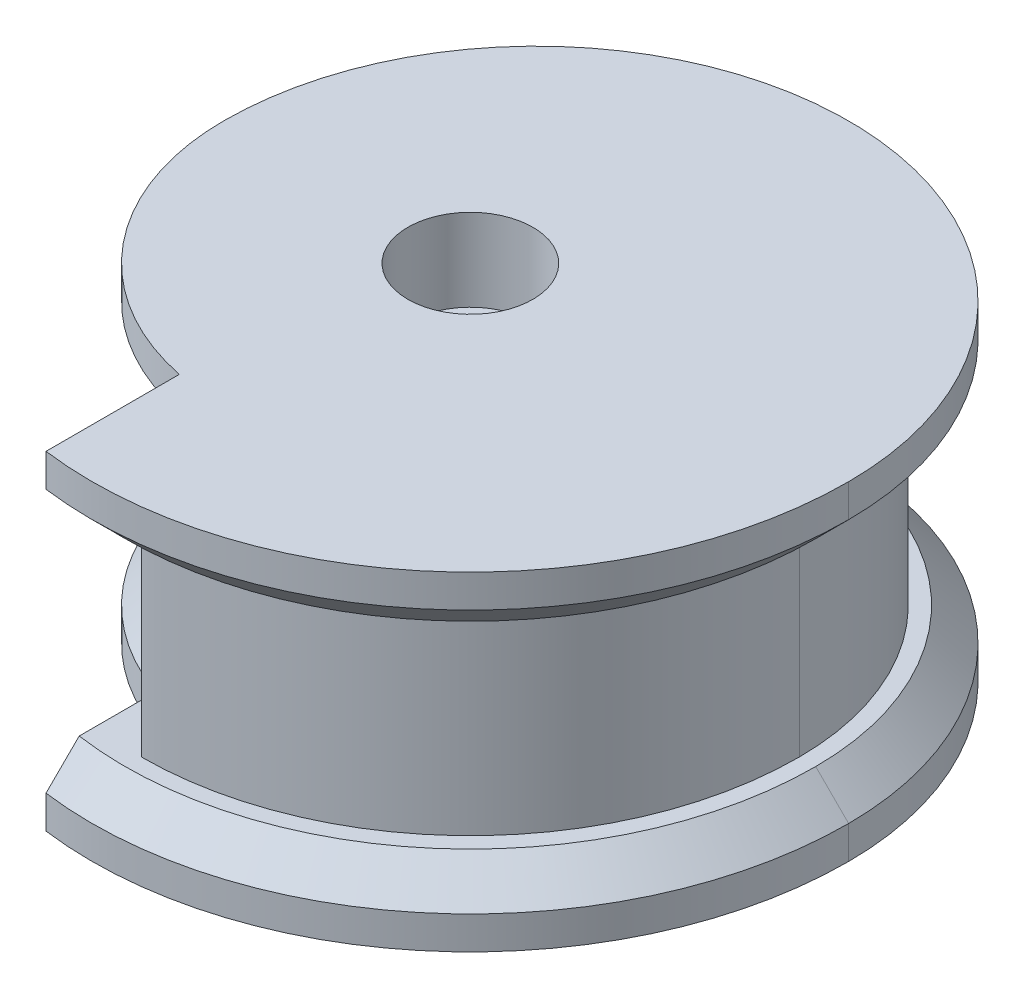
ISO-10303-21;
HEADER;
FILE_DESCRIPTION(('STEP AP214'),'2;1');
FILE_NAME('part.step','',(''),(''),'','','');
FILE_SCHEMA(('AUTOMOTIVE_DESIGN { 1 0 10303 214 1 1 1 1 }'));
ENDSEC;
DATA;
#1=APPLICATION_CONTEXT('core data for automotive mechanical design processes');
#2=APPLICATION_PROTOCOL_DEFINITION('international standard','automotive_design',2000,#1);
#3=PRODUCT_CONTEXT('',#1,'mechanical');
#4=PRODUCT('Part','Part','',(#3));
#5=PRODUCT_RELATED_PRODUCT_CATEGORY('part','',(#4));
#6=PRODUCT_DEFINITION_FORMATION('','',#4);
#7=PRODUCT_DEFINITION_CONTEXT('part definition',#1,'design');
#8=PRODUCT_DEFINITION('design','',#6,#7);
#9=PRODUCT_DEFINITION_SHAPE('','',#8);
#10=(LENGTH_UNIT() NAMED_UNIT(*) SI_UNIT(.MILLI.,.METRE.));
#11=(NAMED_UNIT(*) PLANE_ANGLE_UNIT() SI_UNIT($,.RADIAN.));
#12=(NAMED_UNIT(*) SI_UNIT($,.STERADIAN.) SOLID_ANGLE_UNIT());
#13=UNCERTAINTY_MEASURE_WITH_UNIT(LENGTH_MEASURE(1.E-05),#10,'distance_accuracy_value','');
#14=(GEOMETRIC_REPRESENTATION_CONTEXT(3) GLOBAL_UNCERTAINTY_ASSIGNED_CONTEXT((#13)) GLOBAL_UNIT_ASSIGNED_CONTEXT((#10,
#11,#12)) REPRESENTATION_CONTEXT('',''));
#15=CARTESIAN_POINT('',(0.,0.,0.));
#16=DIRECTION('',(0.,0.,1.));
#17=DIRECTION('',(1.,0.,0.));
#18=AXIS2_PLACEMENT_3D('',#15,#16,#17);
#19=CARTESIAN_POINT('',(0.,10.,0.));
#20=DIRECTION('',(0.,-1.,0.));
#21=DIRECTION('',(0.,0.,-1.));
#22=AXIS2_PLACEMENT_3D('',#19,#20,#21);
#23=CYLINDRICAL_SURFACE('',#22,6.);
#24=CARTESIAN_POINT('',(0.,8.,0.));
#25=DIRECTION('',(0.,1.,0.));
#26=DIRECTION('',(0.,0.,1.));
#27=AXIS2_PLACEMENT_3D('',#24,#25,#26);
#28=CIRCLE('',#27,6.);
#29=CARTESIAN_POINT('',(-6.,8.,0.));
#30=VERTEX_POINT('',#29);
#31=CARTESIAN_POINT('',(0.,8.,6.));
#32=VERTEX_POINT('',#31);
#33=EDGE_CURVE('E197',#30,#32,#28,.T.);
#34=ORIENTED_EDGE('',*,*,#33,.F.);
#35=DIRECTION('',(0.,-1.,0.));
#36=VECTOR('',#35,1.);
#37=CARTESIAN_POINT('',(-6.,34.0831891575846,0.));
#38=LINE('',#37,#36);
#39=CARTESIAN_POINT('',(-6.,2.,0.));
#40=VERTEX_POINT('',#39);
#41=EDGE_CURVE('E237',#30,#40,#38,.T.);
#42=ORIENTED_EDGE('',*,*,#41,.T.);
#43=CARTESIAN_POINT('',(0.,2.,0.));
#44=DIRECTION('',(0.,-1.,0.));
#45=DIRECTION('',(0.,0.,-1.));
#46=AXIS2_PLACEMENT_3D('',#43,#44,#45);
#47=CIRCLE('',#46,6.);
#48=CARTESIAN_POINT('',(0.,2.,6.));
#49=VERTEX_POINT('',#48);
#50=EDGE_CURVE('E199',#49,#40,#47,.T.);
#51=ORIENTED_EDGE('',*,*,#50,.F.);
#52=DIRECTION('',(0.,-1.,0.));
#53=VECTOR('',#52,1.);
#54=CARTESIAN_POINT('',(0.,34.0831891575846,6.));
#55=LINE('',#54,#53);
#56=EDGE_CURVE('E228',#32,#49,#55,.T.);
#57=ORIENTED_EDGE('',*,*,#56,.F.);
#58=EDGE_LOOP('',(#34,#42,#51,#57));
#59=FACE_BOUND('',#58,.T.);
#60=ADVANCED_FACE('F33',(#59),#23,.T.);
#61=CARTESIAN_POINT('',(0.,34.0831891575846,6.));
#62=DIRECTION('',(-1.,0.,0.));
#63=DIRECTION('',(0.,0.,1.));
#64=AXIS2_PLACEMENT_3D('',#61,#62,#63);
#65=PLANE('',#64);
#66=DIRECTION('',(0.,-1.,0.));
#67=VECTOR('',#66,1.);
#68=CARTESIAN_POINT('',(0.,34.0831891575846,10.));
#69=LINE('',#68,#67);
#70=CARTESIAN_POINT('',(0.,8.,10.));
#71=VERTEX_POINT('',#70);
#72=CARTESIAN_POINT('',(0.,2.,10.));
#73=VERTEX_POINT('',#72);
#74=EDGE_CURVE('E236',#71,#73,#69,.T.);
#75=ORIENTED_EDGE('',*,*,#74,.F.);
#76=DIRECTION('',(0.,0.,-1.));
#77=VECTOR('',#76,1.);
#78=CARTESIAN_POINT('',(0.,8.,6.));
#79=LINE('',#78,#77);
#80=EDGE_CURVE('E194',#71,#32,#79,.T.);
#81=ORIENTED_EDGE('',*,*,#80,.T.);
#82=ORIENTED_EDGE('',*,*,#56,.T.);
#83=DIRECTION('',(0.,0.,-1.));
#84=VECTOR('',#83,1.);
#85=CARTESIAN_POINT('',(0.,2.,10.));
#86=LINE('',#85,#84);
#87=EDGE_CURVE('E208',#73,#49,#86,.T.);
#88=ORIENTED_EDGE('',*,*,#87,.F.);
#89=EDGE_LOOP('',(#75,#81,#82,#88));
#90=FACE_BOUND('',#89,.T.);
#91=ADVANCED_FACE('F343',(#90),#65,.T.);
#92=CARTESIAN_POINT('',(2.,34.0831891575846,0.));
#93=DIRECTION('',(0.,-1.,0.));
#94=DIRECTION('',(0.,0.,-1.));
#95=AXIS2_PLACEMENT_3D('',#92,#93,#94);
#96=CYLINDRICAL_SURFACE('',#95,8.);
#97=ORIENTED_EDGE('',*,*,#41,.F.);
#98=CARTESIAN_POINT('',(2.,8.,0.));
#99=DIRECTION('',(0.,1.,0.));
#100=DIRECTION('',(0.,0.,1.));
#101=AXIS2_PLACEMENT_3D('',#98,#99,#100);
#102=CIRCLE('',#101,8.);
#103=CARTESIAN_POINT('',(10.,8.,0.));
#104=VERTEX_POINT('',#103);
#105=EDGE_CURVE('E191',#30,#104,#102,.F.);
#106=ORIENTED_EDGE('',*,*,#105,.T.);
#107=DIRECTION('',(0.,-1.,0.));
#108=VECTOR('',#107,1.);
#109=CARTESIAN_POINT('',(10.,34.0831891575846,0.));
#110=LINE('',#109,#108);
#111=CARTESIAN_POINT('',(10.,2.,0.));
#112=VERTEX_POINT('',#111);
#113=EDGE_CURVE('E234',#104,#112,#110,.T.);
#114=ORIENTED_EDGE('',*,*,#113,.T.);
#115=CARTESIAN_POINT('',(2.,2.,0.));
#116=DIRECTION('',(0.,-1.,0.));
#117=DIRECTION('',(0.,0.,-1.));
#118=AXIS2_PLACEMENT_3D('',#115,#116,#117);
#119=CIRCLE('',#118,8.);
#120=EDGE_CURVE('E202',#40,#112,#119,.T.);
#121=ORIENTED_EDGE('',*,*,#120,.F.);
#122=EDGE_LOOP('',(#97,#106,#114,#121));
#123=FACE_BOUND('',#122,.T.);
#124=ADVANCED_FACE('F349',(#123),#96,.T.);
#125=CARTESIAN_POINT('',(0.,34.0831891575846,0.));
#126=DIRECTION('',(0.,-1.,0.));
#127=DIRECTION('',(0.,0.,-1.));
#128=AXIS2_PLACEMENT_3D('',#125,#126,#127);
#129=CYLINDRICAL_SURFACE('',#128,10.);
#130=ORIENTED_EDGE('',*,*,#113,.F.);
#131=CARTESIAN_POINT('',(0.,8.,0.));
#132=DIRECTION('',(0.,1.,0.));
#133=DIRECTION('',(0.,0.,1.));
#134=AXIS2_PLACEMENT_3D('',#131,#132,#133);
#135=CIRCLE('',#134,10.);
#136=EDGE_CURVE('E185',#104,#71,#135,.F.);
#137=ORIENTED_EDGE('',*,*,#136,.T.);
#138=ORIENTED_EDGE('',*,*,#74,.T.);
#139=CARTESIAN_POINT('',(0.,2.,0.));
#140=DIRECTION('',(0.,-1.,0.));
#141=DIRECTION('',(0.,0.,-1.));
#142=AXIS2_PLACEMENT_3D('',#139,#140,#141);
#143=CIRCLE('',#142,10.);
#144=EDGE_CURVE('E205',#112,#73,#143,.T.);
#145=ORIENTED_EDGE('',*,*,#144,.F.);
#146=EDGE_LOOP('',(#130,#137,#138,#145));
#147=FACE_BOUND('',#146,.T.);
#148=ADVANCED_FACE('F395',(#147),#129,.T.);
#149=CARTESIAN_POINT('',(0.,2.,0.));
#150=DIRECTION('',(0.,-1.,0.));
#151=DIRECTION('',(0.,0.,-1.));
#152=AXIS2_PLACEMENT_3D('',#149,#150,#151);
#153=CYLINDRICAL_SURFACE('',#152,11.5);
#154=DIRECTION('',(0.,-1.,0.));
#155=VECTOR('',#154,1.);
#156=CARTESIAN_POINT('',(11.5,2.,0.));
#157=LINE('',#156,#155);
#158=CARTESIAN_POINT('',(11.5,0.999999999999999,0.));
#159=VERTEX_POINT('',#158);
#160=CARTESIAN_POINT('',(11.5,0.,0.));
#161=VERTEX_POINT('',#160);
#162=EDGE_CURVE('E226',#159,#161,#157,.T.);
#163=ORIENTED_EDGE('',*,*,#162,.F.);
#164=CARTESIAN_POINT('',(0.,0.999999999999999,0.));
#165=DIRECTION('',(0.,-1.,0.));
#166=DIRECTION('',(0.,0.,-1.));
#167=AXIS2_PLACEMENT_3D('',#164,#165,#166);
#168=CIRCLE('',#167,11.5);
#169=CARTESIAN_POINT('',(-1.5,0.999999999999997,11.4017542509914));
#170=VERTEX_POINT('',#169);
#171=EDGE_CURVE('E265',#159,#170,#168,.T.);
#172=ORIENTED_EDGE('',*,*,#171,.T.);
#173=DIRECTION('',(0.,-1.,0.));
#174=VECTOR('',#173,1.);
#175=CARTESIAN_POINT('',(-1.5,2.,11.4017542509914));
#176=LINE('',#175,#174);
#177=CARTESIAN_POINT('',(-1.5,0.,11.4017542509914));
#178=VERTEX_POINT('',#177);
#179=EDGE_CURVE('E214',#170,#178,#176,.T.);
#180=ORIENTED_EDGE('',*,*,#179,.T.);
#181=CARTESIAN_POINT('',(0.,0.,0.));
#182=DIRECTION('',(0.,-1.,0.));
#183=DIRECTION('',(0.,0.,-1.));
#184=AXIS2_PLACEMENT_3D('',#181,#182,#183);
#185=CIRCLE('',#184,11.5);
#186=EDGE_CURVE('E211',#161,#178,#185,.T.);
#187=ORIENTED_EDGE('',*,*,#186,.F.);
#188=EDGE_LOOP('',(#163,#172,#180,#187));
#189=FACE_BOUND('',#188,.T.);
#190=ADVANCED_FACE('F393',(#189),#153,.T.);
#191=CARTESIAN_POINT('',(2.,2.,0.));
#192=DIRECTION('',(0.,-1.,0.));
#193=DIRECTION('',(0.,0.,-1.));
#194=AXIS2_PLACEMENT_3D('',#191,#192,#193);
#195=CYLINDRICAL_SURFACE('',#194,9.5);
#196=DIRECTION('',(0.,-1.,0.));
#197=VECTOR('',#196,1.);
#198=CARTESIAN_POINT('',(-7.5,2.,0.));
#199=LINE('',#198,#197);
#200=CARTESIAN_POINT('',(-7.5,0.999999999999999,0.));
#201=VERTEX_POINT('',#200);
#202=CARTESIAN_POINT('',(-7.5,0.,0.));
#203=VERTEX_POINT('',#202);
#204=EDGE_CURVE('E229',#201,#203,#199,.T.);
#205=ORIENTED_EDGE('',*,*,#204,.F.);
#206=CARTESIAN_POINT('',(2.,0.999999999999999,0.));
#207=DIRECTION('',(0.,-1.,0.));
#208=DIRECTION('',(0.,0.,-1.));
#209=AXIS2_PLACEMENT_3D('',#206,#207,#208);
#210=CIRCLE('',#209,9.5);
#211=EDGE_CURVE('E263',#201,#159,#210,.T.);
#212=ORIENTED_EDGE('',*,*,#211,.T.);
#213=ORIENTED_EDGE('',*,*,#162,.T.);
#214=CARTESIAN_POINT('',(2.,0.,0.));
#215=DIRECTION('',(0.,-1.,0.));
#216=DIRECTION('',(0.,0.,-1.));
#217=AXIS2_PLACEMENT_3D('',#214,#215,#216);
#218=CIRCLE('',#217,9.5);
#219=EDGE_CURVE('E215',#203,#161,#218,.T.);
#220=ORIENTED_EDGE('',*,*,#219,.F.);
#221=EDGE_LOOP('',(#205,#212,#213,#220));
#222=FACE_BOUND('',#221,.T.);
#223=ADVANCED_FACE('F392',(#222),#195,.T.);
#224=CARTESIAN_POINT('',(0.,2.,0.));
#225=DIRECTION('',(0.,-1.,0.));
#226=DIRECTION('',(0.,0.,-1.));
#227=AXIS2_PLACEMENT_3D('',#224,#225,#226);
#228=CYLINDRICAL_SURFACE('',#227,7.5);
#229=DIRECTION('',(0.,-1.,0.));
#230=VECTOR('',#229,1.);
#231=CARTESIAN_POINT('',(-1.5,2.,7.34846922834954));
#232=LINE('',#231,#230);
#233=CARTESIAN_POINT('',(-1.5,0.999999999999999,7.34846922834954));
#234=VERTEX_POINT('',#233);
#235=CARTESIAN_POINT('',(-1.5,0.,7.34846922834954));
#236=VERTEX_POINT('',#235);
#237=EDGE_CURVE('E231',#234,#236,#232,.T.);
#238=ORIENTED_EDGE('',*,*,#237,.F.);
#239=CARTESIAN_POINT('',(0.,0.999999999999999,0.));
#240=DIRECTION('',(0.,-1.,0.));
#241=DIRECTION('',(0.,0.,-1.));
#242=AXIS2_PLACEMENT_3D('',#239,#240,#241);
#243=CIRCLE('',#242,7.5);
#244=EDGE_CURVE('E251',#234,#201,#243,.T.);
#245=ORIENTED_EDGE('',*,*,#244,.T.);
#246=ORIENTED_EDGE('',*,*,#204,.T.);
#247=CARTESIAN_POINT('',(0.,0.,0.));
#248=DIRECTION('',(0.,-1.,0.));
#249=DIRECTION('',(0.,0.,-1.));
#250=AXIS2_PLACEMENT_3D('',#247,#248,#249);
#251=CIRCLE('',#250,7.5);
#252=EDGE_CURVE('E221',#236,#203,#251,.T.);
#253=ORIENTED_EDGE('',*,*,#252,.F.);
#254=EDGE_LOOP('',(#238,#245,#246,#253));
#255=FACE_BOUND('',#254,.T.);
#256=ADVANCED_FACE('F376',(#255),#228,.T.);
#257=CARTESIAN_POINT('',(-1.5,2.,11.4017542509914));
#258=DIRECTION('',(-1.,0.,0.));
#259=DIRECTION('',(0.,0.,1.));
#260=AXIS2_PLACEMENT_3D('',#257,#258,#259);
#261=PLANE('',#260);
#262=ORIENTED_EDGE('',*,*,#179,.F.);
#263=CARTESIAN_POINT('',(-1.5,0.999999999999999,11.4017542509914));
#264=CARTESIAN_POINT('',(-1.5,1.16673926738492,11.233584605207));
#265=CARTESIAN_POINT('',(-1.5,1.33344223423444,11.0653789986947));
#266=CARTESIAN_POINT('',(-1.5,1.66677556756808,10.7288958635023));
#267=CARTESIAN_POINT('',(-1.5,1.83340593405189,10.5606183348219));
#268=CARTESIAN_POINT('',(-1.5,2.,10.3923048454133));
#269=B_SPLINE_CURVE_WITH_KNOTS('',3,(#263,#264,#265,#266,#267,#268),.UNSPECIFIED.,.F.,.F.,(4,2,
4),(0.,0.710455520752282,1.42091104451142),.UNSPECIFIED.);
#270=CARTESIAN_POINT('',(-1.5,2.,10.3923048454133));
#271=VERTEX_POINT('',#270);
#272=EDGE_CURVE('E267',#170,#271,#269,.T.);
#273=ORIENTED_EDGE('',*,*,#272,.T.);
#274=DIRECTION('',(0.,0.,-1.));
#275=VECTOR('',#274,1.);
#276=CARTESIAN_POINT('',(-1.5,2.,11.4017542509914));
#277=LINE('',#276,#275);
#278=CARTESIAN_POINT('',(-1.5,2.,6.32455532033676));
#279=VERTEX_POINT('',#278);
#280=EDGE_CURVE('E212',#271,#279,#277,.T.);
#281=ORIENTED_EDGE('',*,*,#280,.T.);
#282=CARTESIAN_POINT('',(-1.5,2.,6.32455532033676));
#283=CARTESIAN_POINT('',(-1.5,1.83362822537251,6.49549566084221));
#284=CARTESIAN_POINT('',(-1.5,1.66710900027319,6.66629199463899));
#285=CARTESIAN_POINT('',(-1.5,1.3337756669084,7.00759663061252));
#286=CARTESIAN_POINT('',(-1.5,1.16696155867439,7.17810493282));
#287=CARTESIAN_POINT('',(-1.5,0.999999999999999,7.34846922834954));
#288=B_SPLINE_CURVE_WITH_KNOTS('',3,(#282,#283,#284,#285,#286,#287),.UNSPECIFIED.,.F.,.F.,(4,2,
4),(0.,0.715611877832469,1.43122367933399),.UNSPECIFIED.);
#289=EDGE_CURVE('E43',#279,#234,#288,.T.);
#290=ORIENTED_EDGE('',*,*,#289,.T.);
#291=ORIENTED_EDGE('',*,*,#237,.T.);
#292=DIRECTION('',(0.,0.,-1.));
#293=VECTOR('',#292,1.);
#294=CARTESIAN_POINT('',(-1.5,0.,11.4017542509914));
#295=LINE('',#294,#293);
#296=EDGE_CURVE('E218',#178,#236,#295,.T.);
#297=ORIENTED_EDGE('',*,*,#296,.F.);
#298=EDGE_LOOP('',(#262,#273,#281,#290,#291,#297));
#299=FACE_BOUND('',#298,.T.);
#300=ADVANCED_FACE('F275',(#299),#261,.T.);
#301=CARTESIAN_POINT('',(0.,2.,0.));
#302=DIRECTION('',(0.,-1.,0.));
#303=DIRECTION('',(0.,0.,-1.));
#304=AXIS2_PLACEMENT_3D('',#301,#302,#303);
#305=PLANE('',#304);
#306=ORIENTED_EDGE('',*,*,#87,.T.);
#307=ORIENTED_EDGE('',*,*,#50,.T.);
#308=ORIENTED_EDGE('',*,*,#120,.T.);
#309=ORIENTED_EDGE('',*,*,#144,.T.);
#310=EDGE_LOOP('',(#306,#307,#308,#309));
#311=FACE_BOUND('',#310,.T.);
#312=CARTESIAN_POINT('',(0.,2.,0.));
#313=DIRECTION('',(0.,-1.,0.));
#314=DIRECTION('',(0.,0.,-1.));
#315=AXIS2_PLACEMENT_3D('',#312,#313,#314);
#316=CIRCLE('',#315,6.5);
#317=CARTESIAN_POINT('',(-6.5,2.,0.));
#318=VERTEX_POINT('',#317);
#319=EDGE_CURVE('E260',#318,#279,#316,.F.);
#320=ORIENTED_EDGE('',*,*,#319,.T.);
#321=ORIENTED_EDGE('',*,*,#280,.F.);
#322=CARTESIAN_POINT('',(0.,2.,0.));
#323=DIRECTION('',(0.,-1.,0.));
#324=DIRECTION('',(0.,0.,-1.));
#325=AXIS2_PLACEMENT_3D('',#322,#323,#324);
#326=CIRCLE('',#325,10.5);
#327=CARTESIAN_POINT('',(10.5,2.,0.));
#328=VERTEX_POINT('',#327);
#329=EDGE_CURVE('E256',#271,#328,#326,.F.);
#330=ORIENTED_EDGE('',*,*,#329,.T.);
#331=CARTESIAN_POINT('',(2.,2.,0.));
#332=DIRECTION('',(0.,-1.,0.));
#333=DIRECTION('',(0.,0.,-1.));
#334=AXIS2_PLACEMENT_3D('',#331,#332,#333);
#335=CIRCLE('',#334,8.5);
#336=EDGE_CURVE('E258',#328,#318,#335,.F.);
#337=ORIENTED_EDGE('',*,*,#336,.T.);
#338=EDGE_LOOP('',(#320,#321,#330,#337));
#339=FACE_BOUND('',#338,.T.);
#340=ADVANCED_FACE('F388',(#311,#339),#305,.F.);
#341=CARTESIAN_POINT('',(0.,4.8,0.));
#342=DIRECTION('',(0.,-1.,0.));
#343=DIRECTION('',(0.,0.,-1.));
#344=AXIS2_PLACEMENT_3D('',#341,#342,#343);
#345=PLANE('',#344);
#346=CARTESIAN_POINT('',(0.,4.8,0.));
#347=DIRECTION('',(0.,-1.,0.));
#348=DIRECTION('',(0.,0.,-1.));
#349=AXIS2_PLACEMENT_3D('',#346,#347,#348);
#350=CIRCLE('',#349,3.75);
#351=CARTESIAN_POINT('',(0.,4.8,-3.75));
#352=VERTEX_POINT('',#351);
#353=EDGE_CURVE('E242',#352,#352,#350,.T.);
#354=ORIENTED_EDGE('',*,*,#353,.T.);
#355=EDGE_LOOP('',(#354));
#356=FACE_BOUND('',#355,.T.);
#357=ADVANCED_FACE('F408',(#356),#345,.T.);
#358=CARTESIAN_POINT('',(0.,4.8,0.));
#359=DIRECTION('',(0.,-1.,0.));
#360=DIRECTION('',(0.,0.,-1.));
#361=AXIS2_PLACEMENT_3D('',#358,#359,#360);
#362=CYLINDRICAL_SURFACE('',#361,3.75);
#363=ORIENTED_EDGE('',*,*,#353,.F.);
#364=EDGE_LOOP('',(#363));
#365=FACE_BOUND('',#364,.T.);
#366=CARTESIAN_POINT('',(0.,0.,0.));
#367=DIRECTION('',(0.,-1.,0.));
#368=DIRECTION('',(0.,0.,-1.));
#369=AXIS2_PLACEMENT_3D('',#366,#367,#368);
#370=CIRCLE('',#369,3.75);
#371=CARTESIAN_POINT('',(0.,0.,-3.75));
#372=VERTEX_POINT('',#371);
#373=EDGE_CURVE('E241',#372,#372,#370,.T.);
#374=ORIENTED_EDGE('',*,*,#373,.T.);
#375=EDGE_LOOP('',(#374));
#376=FACE_BOUND('',#375,.T.);
#377=ADVANCED_FACE('F411',(#365,#376),#362,.F.);
#378=CARTESIAN_POINT('',(0.,0.,0.));
#379=DIRECTION('',(0.,1.,0.));
#380=DIRECTION('',(0.,0.,1.));
#381=AXIS2_PLACEMENT_3D('',#378,#379,#380);
#382=PLANE('',#381);
#383=ORIENTED_EDGE('',*,*,#373,.F.);
#384=EDGE_LOOP('',(#383));
#385=FACE_BOUND('',#384,.T.);
#386=ORIENTED_EDGE('',*,*,#186,.T.);
#387=ORIENTED_EDGE('',*,*,#296,.T.);
#388=ORIENTED_EDGE('',*,*,#252,.T.);
#389=ORIENTED_EDGE('',*,*,#219,.T.);
#390=EDGE_LOOP('',(#386,#387,#388,#389));
#391=FACE_BOUND('',#390,.T.);
#392=ADVANCED_FACE('F354',(#385,#391),#382,.F.);
#393=CARTESIAN_POINT('',(0.,8.,0.));
#394=DIRECTION('',(0.,1.,0.));
#395=DIRECTION('',(0.,0.,1.));
#396=AXIS2_PLACEMENT_3D('',#393,#394,#395);
#397=PLANE('',#396);
#398=DIRECTION('',(0.,0.,1.));
#399=VECTOR('',#398,1.);
#400=CARTESIAN_POINT('',(-1.5,8.,11.4017542509914));
#401=LINE('',#400,#399);
#402=CARTESIAN_POINT('',(-1.5,8.,6.32455532033676));
#403=VERTEX_POINT('',#402);
#404=CARTESIAN_POINT('',(-1.5,8.,10.3923048454133));
#405=VERTEX_POINT('',#404);
#406=EDGE_CURVE('E161',#403,#405,#401,.T.);
#407=ORIENTED_EDGE('',*,*,#406,.F.);
#408=CARTESIAN_POINT('',(0.,8.,0.));
#409=DIRECTION('',(0.,1.,0.));
#410=DIRECTION('',(0.,0.,1.));
#411=AXIS2_PLACEMENT_3D('',#408,#409,#410);
#412=CIRCLE('',#411,6.5);
#413=CARTESIAN_POINT('',(-6.5,8.,0.));
#414=VERTEX_POINT('',#413);
#415=EDGE_CURVE('E318',#403,#414,#412,.F.);
#416=ORIENTED_EDGE('',*,*,#415,.T.);
#417=CARTESIAN_POINT('',(2.,8.,0.));
#418=DIRECTION('',(0.,1.,0.));
#419=DIRECTION('',(0.,0.,1.));
#420=AXIS2_PLACEMENT_3D('',#417,#418,#419);
#421=CIRCLE('',#420,8.5);
#422=CARTESIAN_POINT('',(10.5,8.,0.));
#423=VERTEX_POINT('',#422);
#424=EDGE_CURVE('E320',#414,#423,#421,.F.);
#425=ORIENTED_EDGE('',*,*,#424,.T.);
#426=CARTESIAN_POINT('',(0.,8.,0.));
#427=DIRECTION('',(0.,1.,0.));
#428=DIRECTION('',(0.,0.,1.));
#429=AXIS2_PLACEMENT_3D('',#426,#427,#428);
#430=CIRCLE('',#429,10.5);
#431=EDGE_CURVE('E321',#423,#405,#430,.F.);
#432=ORIENTED_EDGE('',*,*,#431,.T.);
#433=EDGE_LOOP('',(#407,#416,#425,#432));
#434=FACE_BOUND('',#433,.T.);
#435=ORIENTED_EDGE('',*,*,#105,.F.);
#436=ORIENTED_EDGE('',*,*,#33,.T.);
#437=ORIENTED_EDGE('',*,*,#80,.F.);
#438=ORIENTED_EDGE('',*,*,#136,.F.);
#439=EDGE_LOOP('',(#435,#436,#437,#438));
#440=FACE_BOUND('',#439,.T.);
#441=ADVANCED_FACE('F324',(#434,#440),#397,.F.);
#442=CARTESIAN_POINT('',(0.,8.,0.));
#443=DIRECTION('',(0.,1.,0.));
#444=DIRECTION('',(0.,0.,1.));
#445=AXIS2_PLACEMENT_3D('',#442,#443,#444);
#446=CYLINDRICAL_SURFACE('',#445,7.5);
#447=DIRECTION('',(0.,1.,0.));
#448=VECTOR('',#447,1.);
#449=CARTESIAN_POINT('',(-7.5,8.,0.));
#450=LINE('',#449,#448);
#451=CARTESIAN_POINT('',(-7.5,9.,0.));
#452=VERTEX_POINT('',#451);
#453=CARTESIAN_POINT('',(-7.5,10.,0.));
#454=VERTEX_POINT('',#453);
#455=EDGE_CURVE('E183',#452,#454,#450,.T.);
#456=ORIENTED_EDGE('',*,*,#455,.F.);
#457=CARTESIAN_POINT('',(0.,9.,0.));
#458=DIRECTION('',(0.,1.,0.));
#459=DIRECTION('',(0.,0.,1.));
#460=AXIS2_PLACEMENT_3D('',#457,#458,#459);
#461=CIRCLE('',#460,7.5);
#462=CARTESIAN_POINT('',(-1.5,9.,7.34846922834954));
#463=VERTEX_POINT('',#462);
#464=EDGE_CURVE('E159',#452,#463,#461,.T.);
#465=ORIENTED_EDGE('',*,*,#464,.T.);
#466=DIRECTION('',(0.,1.,0.));
#467=VECTOR('',#466,1.);
#468=CARTESIAN_POINT('',(-1.5,8.,7.34846922834954));
#469=LINE('',#468,#467);
#470=CARTESIAN_POINT('',(-1.5,10.,7.34846922834954));
#471=VERTEX_POINT('',#470);
#472=EDGE_CURVE('E151',#463,#471,#469,.T.);
#473=ORIENTED_EDGE('',*,*,#472,.T.);
#474=CARTESIAN_POINT('',(0.,10.,0.));
#475=DIRECTION('',(0.,1.,0.));
#476=DIRECTION('',(0.,0.,1.));
#477=AXIS2_PLACEMENT_3D('',#474,#475,#476);
#478=CIRCLE('',#477,7.5);
#479=EDGE_CURVE('E156',#454,#471,#478,.T.);
#480=ORIENTED_EDGE('',*,*,#479,.F.);
#481=EDGE_LOOP('',(#456,#465,#473,#480));
#482=FACE_BOUND('',#481,.T.);
#483=ADVANCED_FACE('F154',(#482),#446,.T.);
#484=CARTESIAN_POINT('',(2.,8.,0.));
#485=DIRECTION('',(0.,1.,0.));
#486=DIRECTION('',(0.,0.,1.));
#487=AXIS2_PLACEMENT_3D('',#484,#485,#486);
#488=CYLINDRICAL_SURFACE('',#487,9.5);
#489=DIRECTION('',(0.,1.,0.));
#490=VECTOR('',#489,1.);
#491=CARTESIAN_POINT('',(11.5,8.,0.));
#492=LINE('',#491,#490);
#493=CARTESIAN_POINT('',(11.5,9.,0.));
#494=VERTEX_POINT('',#493);
#495=CARTESIAN_POINT('',(11.5,10.,0.));
#496=VERTEX_POINT('',#495);
#497=EDGE_CURVE('E186',#494,#496,#492,.T.);
#498=ORIENTED_EDGE('',*,*,#497,.F.);
#499=CARTESIAN_POINT('',(2.,9.,0.));
#500=DIRECTION('',(0.,1.,0.));
#501=DIRECTION('',(0.,0.,1.));
#502=AXIS2_PLACEMENT_3D('',#499,#500,#501);
#503=CIRCLE('',#502,9.5);
#504=EDGE_CURVE('E316',#494,#452,#503,.T.);
#505=ORIENTED_EDGE('',*,*,#504,.T.);
#506=ORIENTED_EDGE('',*,*,#455,.T.);
#507=CARTESIAN_POINT('',(2.,10.,0.));
#508=DIRECTION('',(0.,1.,0.));
#509=DIRECTION('',(0.,0.,1.));
#510=AXIS2_PLACEMENT_3D('',#507,#508,#509);
#511=CIRCLE('',#510,9.5);
#512=EDGE_CURVE('E173',#496,#454,#511,.T.);
#513=ORIENTED_EDGE('',*,*,#512,.F.);
#514=EDGE_LOOP('',(#498,#505,#506,#513));
#515=FACE_BOUND('',#514,.T.);
#516=ADVANCED_FACE('F337',(#515),#488,.T.);
#517=CARTESIAN_POINT('',(0.,8.,0.));
#518=DIRECTION('',(0.,1.,0.));
#519=DIRECTION('',(0.,0.,1.));
#520=AXIS2_PLACEMENT_3D('',#517,#518,#519);
#521=CYLINDRICAL_SURFACE('',#520,11.5);
#522=DIRECTION('',(0.,1.,0.));
#523=VECTOR('',#522,1.);
#524=CARTESIAN_POINT('',(-1.5,8.,11.4017542509914));
#525=LINE('',#524,#523);
#526=CARTESIAN_POINT('',(-1.5,9.,11.4017542509914));
#527=VERTEX_POINT('',#526);
#528=CARTESIAN_POINT('',(-1.5,10.,11.4017542509914));
#529=VERTEX_POINT('',#528);
#530=EDGE_CURVE('E160',#527,#529,#525,.T.);
#531=ORIENTED_EDGE('',*,*,#530,.F.);
#532=CARTESIAN_POINT('',(0.,9.,0.));
#533=DIRECTION('',(0.,1.,0.));
#534=DIRECTION('',(0.,0.,1.));
#535=AXIS2_PLACEMENT_3D('',#532,#533,#534);
#536=CIRCLE('',#535,11.5);
#537=EDGE_CURVE('E58',#527,#494,#536,.T.);
#538=ORIENTED_EDGE('',*,*,#537,.T.);
#539=ORIENTED_EDGE('',*,*,#497,.T.);
#540=CARTESIAN_POINT('',(0.,10.,0.));
#541=DIRECTION('',(0.,1.,0.));
#542=DIRECTION('',(0.,0.,1.));
#543=AXIS2_PLACEMENT_3D('',#540,#541,#542);
#544=CIRCLE('',#543,11.5);
#545=EDGE_CURVE('E169',#529,#496,#544,.T.);
#546=ORIENTED_EDGE('',*,*,#545,.F.);
#547=EDGE_LOOP('',(#531,#538,#539,#546));
#548=FACE_BOUND('',#547,.T.);
#549=ADVANCED_FACE('F307',(#548),#521,.T.);
#550=CARTESIAN_POINT('',(-1.5,8.,11.4017542509914));
#551=DIRECTION('',(-1.,0.,0.));
#552=DIRECTION('',(0.,0.,1.));
#553=AXIS2_PLACEMENT_3D('',#550,#551,#552);
#554=PLANE('',#553);
#555=ORIENTED_EDGE('',*,*,#406,.T.);
#556=CARTESIAN_POINT('',(-1.5,8.,10.3923048454133));
#557=CARTESIAN_POINT('',(-1.5,8.16659406594811,10.5606183348219));
#558=CARTESIAN_POINT('',(-1.5,8.33322443243192,10.7288958635023));
#559=CARTESIAN_POINT('',(-1.5,8.66655776576556,11.0653789986947));
#560=CARTESIAN_POINT('',(-1.5,8.83326073261508,11.233584605207));
#561=CARTESIAN_POINT('',(-1.5,9.,11.4017542509914));
#562=B_SPLINE_CURVE_WITH_KNOTS('',3,(#556,#557,#558,#559,#560,#561),.UNSPECIFIED.,.F.,.F.,(4,2,
4),(0.,0.71045552375913,1.42091104451141),.UNSPECIFIED.);
#563=EDGE_CURVE('E51',#405,#527,#562,.T.);
#564=ORIENTED_EDGE('',*,*,#563,.T.);
#565=ORIENTED_EDGE('',*,*,#530,.T.);
#566=DIRECTION('',(0.,0.,1.));
#567=VECTOR('',#566,1.);
#568=CARTESIAN_POINT('',(-1.5,10.,11.4017542509914));
#569=LINE('',#568,#567);
#570=EDGE_CURVE('E164',#471,#529,#569,.T.);
#571=ORIENTED_EDGE('',*,*,#570,.F.);
#572=ORIENTED_EDGE('',*,*,#472,.F.);
#573=CARTESIAN_POINT('',(-1.5,9.,7.34846922834954));
#574=CARTESIAN_POINT('',(-1.5,8.83303844132561,7.17810493282001));
#575=CARTESIAN_POINT('',(-1.5,8.6662243330916,7.00759663061253));
#576=CARTESIAN_POINT('',(-1.5,8.33289099972681,6.66629199463899));
#577=CARTESIAN_POINT('',(-1.5,8.16637177462749,6.49549566084221));
#578=CARTESIAN_POINT('',(-1.5,8.,6.32455532033676));
#579=B_SPLINE_CURVE_WITH_KNOTS('',3,(#573,#574,#575,#576,#577,#578),.UNSPECIFIED.,.F.,.F.,(4,2,
4),(0.,0.715611801501522,1.43122367933399),.UNSPECIFIED.);
#580=EDGE_CURVE('E11',#463,#403,#579,.T.);
#581=ORIENTED_EDGE('',*,*,#580,.T.);
#582=EDGE_LOOP('',(#555,#564,#565,#571,#572,#581));
#583=FACE_BOUND('',#582,.T.);
#584=ADVANCED_FACE('F165',(#583),#554,.T.);
#585=CARTESIAN_POINT('',(0.,7.5,0.));
#586=DIRECTION('',(0.,1.,0.));
#587=DIRECTION('',(0.,0.,1.));
#588=AXIS2_PLACEMENT_3D('',#585,#586,#587);
#589=PLANE('',#588);
#590=CARTESIAN_POINT('',(0.,7.5,0.));
#591=DIRECTION('',(0.,1.,0.));
#592=DIRECTION('',(0.,0.,1.));
#593=AXIS2_PLACEMENT_3D('',#590,#591,#592);
#594=CIRCLE('',#593,1.9);
#595=CARTESIAN_POINT('',(0.,7.5,1.9));
#596=VERTEX_POINT('',#595);
#597=EDGE_CURVE('E248',#596,#596,#594,.T.);
#598=ORIENTED_EDGE('',*,*,#597,.T.);
#599=EDGE_LOOP('',(#598));
#600=FACE_BOUND('',#599,.T.);
#601=ADVANCED_FACE('F306',(#600),#589,.T.);
#602=CARTESIAN_POINT('',(0.,7.5,0.));
#603=DIRECTION('',(0.,1.,0.));
#604=DIRECTION('',(0.,0.,1.));
#605=AXIS2_PLACEMENT_3D('',#602,#603,#604);
#606=CYLINDRICAL_SURFACE('',#605,1.9);
#607=CARTESIAN_POINT('',(0.,10.,0.));
#608=DIRECTION('',(0.,1.,0.));
#609=DIRECTION('',(0.,0.,1.));
#610=AXIS2_PLACEMENT_3D('',#607,#608,#609);
#611=CIRCLE('',#610,1.9);
#612=CARTESIAN_POINT('',(0.,10.,1.9));
#613=VERTEX_POINT('',#612);
#614=EDGE_CURVE('E245',#613,#613,#611,.T.);
#615=ORIENTED_EDGE('',*,*,#614,.T.);
#616=EDGE_LOOP('',(#615));
#617=FACE_BOUND('',#616,.T.);
#618=ORIENTED_EDGE('',*,*,#597,.F.);
#619=EDGE_LOOP('',(#618));
#620=FACE_BOUND('',#619,.T.);
#621=ADVANCED_FACE('F418',(#617,#620),#606,.F.);
#622=CARTESIAN_POINT('',(0.,10.,0.));
#623=DIRECTION('',(0.,1.,0.));
#624=DIRECTION('',(0.,0.,1.));
#625=AXIS2_PLACEMENT_3D('',#622,#623,#624);
#626=PLANE('',#625);
#627=ORIENTED_EDGE('',*,*,#614,.F.);
#628=EDGE_LOOP('',(#627));
#629=FACE_BOUND('',#628,.T.);
#630=ORIENTED_EDGE('',*,*,#479,.T.);
#631=ORIENTED_EDGE('',*,*,#570,.T.);
#632=ORIENTED_EDGE('',*,*,#545,.T.);
#633=ORIENTED_EDGE('',*,*,#512,.T.);
#634=EDGE_LOOP('',(#630,#631,#632,#633));
#635=FACE_BOUND('',#634,.T.);
#636=ADVANCED_FACE('F171',(#629,#635),#626,.T.);
#637=CARTESIAN_POINT('',(0.,0.999999999999999,0.));
#638=DIRECTION('',(0.,-1.,0.));
#639=DIRECTION('',(0.,0.,-1.));
#640=AXIS2_PLACEMENT_3D('',#637,#638,#639);
#641=CONICAL_SURFACE('',#640,11.5,0.785398163397449);
#642=ORIENTED_EDGE('',*,*,#272,.F.);
#643=ORIENTED_EDGE('',*,*,#171,.F.);
#644=DIRECTION('',(0.707106781186548,-0.707106781186547,0.));
#645=VECTOR('',#644,1.);
#646=CARTESIAN_POINT('',(10.5,2.,0.));
#647=LINE('',#646,#645);
#648=EDGE_CURVE('E174',#328,#159,#647,.T.);
#649=ORIENTED_EDGE('',*,*,#648,.F.);
#650=ORIENTED_EDGE('',*,*,#329,.F.);
#651=EDGE_LOOP('',(#642,#643,#649,#650));
#652=FACE_BOUND('',#651,.T.);
#653=ADVANCED_FACE('F279',(#652),#641,.T.);
#654=CARTESIAN_POINT('',(2.,0.999999999999999,0.));
#655=DIRECTION('',(0.,-1.,0.));
#656=DIRECTION('',(0.,0.,-1.));
#657=AXIS2_PLACEMENT_3D('',#654,#655,#656);
#658=CONICAL_SURFACE('',#657,9.5,0.785398163397449);
#659=ORIENTED_EDGE('',*,*,#648,.T.);
#660=ORIENTED_EDGE('',*,*,#211,.F.);
#661=DIRECTION('',(-0.707106781186548,-0.707106781186547,0.));
#662=VECTOR('',#661,1.);
#663=CARTESIAN_POINT('',(-6.5,2.,0.));
#664=LINE('',#663,#662);
#665=EDGE_CURVE('E177',#318,#201,#664,.T.);
#666=ORIENTED_EDGE('',*,*,#665,.F.);
#667=ORIENTED_EDGE('',*,*,#336,.F.);
#668=EDGE_LOOP('',(#659,#660,#666,#667));
#669=FACE_BOUND('',#668,.T.);
#670=ADVANCED_FACE('F284',(#669),#658,.T.);
#671=CARTESIAN_POINT('',(0.,0.999999999999999,0.));
#672=DIRECTION('',(0.,-1.,0.));
#673=DIRECTION('',(0.,0.,-1.));
#674=AXIS2_PLACEMENT_3D('',#671,#672,#673);
#675=CONICAL_SURFACE('',#674,7.5,0.785398163397449);
#676=ORIENTED_EDGE('',*,*,#289,.F.);
#677=ORIENTED_EDGE('',*,*,#319,.F.);
#678=ORIENTED_EDGE('',*,*,#665,.T.);
#679=ORIENTED_EDGE('',*,*,#244,.F.);
#680=EDGE_LOOP('',(#676,#677,#678,#679));
#681=FACE_BOUND('',#680,.T.);
#682=ADVANCED_FACE('F356',(#681),#675,.T.);
#683=CARTESIAN_POINT('',(0.,9.,0.));
#684=DIRECTION('',(0.,1.,0.));
#685=DIRECTION('',(0.,0.,1.));
#686=AXIS2_PLACEMENT_3D('',#683,#684,#685);
#687=CONICAL_SURFACE('',#686,11.5,0.785398163397449);
#688=ORIENTED_EDGE('',*,*,#563,.F.);
#689=ORIENTED_EDGE('',*,*,#431,.F.);
#690=DIRECTION('',(-0.707106781186548,-0.707106781186547,0.));
#691=VECTOR('',#690,1.);
#692=CARTESIAN_POINT('',(11.5,9.,0.));
#693=LINE('',#692,#691);
#694=EDGE_CURVE('E38',#494,#423,#693,.T.);
#695=ORIENTED_EDGE('',*,*,#694,.F.);
#696=ORIENTED_EDGE('',*,*,#537,.F.);
#697=EDGE_LOOP('',(#688,#689,#695,#696));
#698=FACE_BOUND('',#697,.T.);
#699=ADVANCED_FACE('F35',(#698),#687,.T.);
#700=CARTESIAN_POINT('',(2.,9.,0.));
#701=DIRECTION('',(0.,1.,0.));
#702=DIRECTION('',(0.,0.,1.));
#703=AXIS2_PLACEMENT_3D('',#700,#701,#702);
#704=CONICAL_SURFACE('',#703,9.5,0.785398163397449);
#705=ORIENTED_EDGE('',*,*,#694,.T.);
#706=ORIENTED_EDGE('',*,*,#424,.F.);
#707=DIRECTION('',(0.707106781186548,-0.707106781186547,0.));
#708=VECTOR('',#707,1.);
#709=CARTESIAN_POINT('',(-7.5,9.,0.));
#710=LINE('',#709,#708);
#711=EDGE_CURVE('E333',#452,#414,#710,.T.);
#712=ORIENTED_EDGE('',*,*,#711,.F.);
#713=ORIENTED_EDGE('',*,*,#504,.F.);
#714=EDGE_LOOP('',(#705,#706,#712,#713));
#715=FACE_BOUND('',#714,.T.);
#716=ADVANCED_FACE('F290',(#715),#704,.T.);
#717=CARTESIAN_POINT('',(0.,9.,0.));
#718=DIRECTION('',(0.,1.,0.));
#719=DIRECTION('',(0.,0.,1.));
#720=AXIS2_PLACEMENT_3D('',#717,#718,#719);
#721=CONICAL_SURFACE('',#720,7.5,0.78539816339745);
#722=ORIENTED_EDGE('',*,*,#711,.T.);
#723=ORIENTED_EDGE('',*,*,#415,.F.);
#724=ORIENTED_EDGE('',*,*,#580,.F.);
#725=ORIENTED_EDGE('',*,*,#464,.F.);
#726=EDGE_LOOP('',(#722,#723,#724,#725));
#727=FACE_BOUND('',#726,.T.);
#728=ADVANCED_FACE('F287',(#727),#721,.T.);
#729=CLOSED_SHELL('',(#60,#91,#124,#148,#190,#223,#256,#300,#340,#357,#377,#392,#441,#483,#516,
#549,#584,#601,#621,#636,#653,#670,#682,#699,#716,#728));
#730=MANIFOLD_SOLID_BREP('B2',#729);
#731=ADVANCED_BREP_SHAPE_REPRESENTATION('',(#18,#730),#14);
#732=SHAPE_DEFINITION_REPRESENTATION(#9,#731);
ENDSEC;
END-ISO-10303-21;
